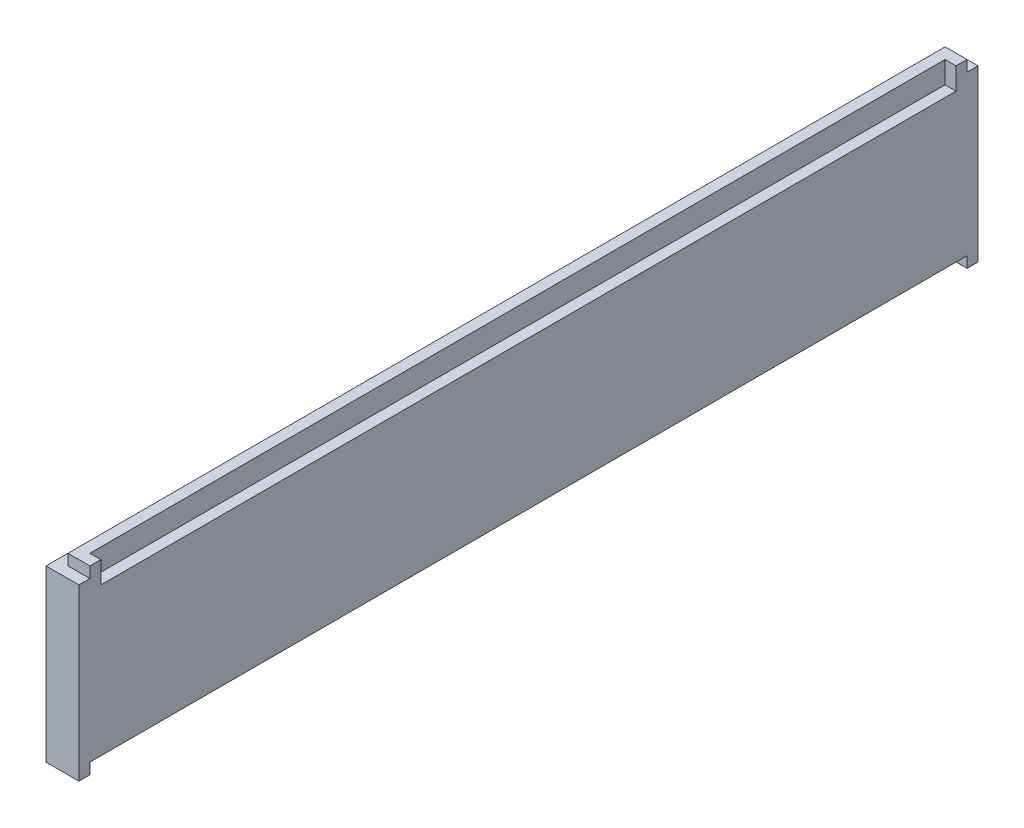
ISO-10303-21;
HEADER;
FILE_DESCRIPTION(('STEP AP214'),'2;1');
FILE_NAME('part.step','',(''),(''),'','','');
FILE_SCHEMA(('AUTOMOTIVE_DESIGN { 1 0 10303 214 1 1 1 1 }'));
ENDSEC;
DATA;
#1=APPLICATION_CONTEXT('core data for automotive mechanical design processes');
#2=APPLICATION_PROTOCOL_DEFINITION('international standard','automotive_design',2000,#1);
#3=PRODUCT_CONTEXT('',#1,'mechanical');
#4=PRODUCT('Part','Part','',(#3));
#5=PRODUCT_RELATED_PRODUCT_CATEGORY('part','',(#4));
#6=PRODUCT_DEFINITION_FORMATION('','',#4);
#7=PRODUCT_DEFINITION_CONTEXT('part definition',#1,'design');
#8=PRODUCT_DEFINITION('design','',#6,#7);
#9=PRODUCT_DEFINITION_SHAPE('','',#8);
#10=(LENGTH_UNIT() NAMED_UNIT(*) SI_UNIT(.MILLI.,.METRE.));
#11=(NAMED_UNIT(*) PLANE_ANGLE_UNIT() SI_UNIT($,.RADIAN.));
#12=(NAMED_UNIT(*) SI_UNIT($,.STERADIAN.) SOLID_ANGLE_UNIT());
#13=UNCERTAINTY_MEASURE_WITH_UNIT(LENGTH_MEASURE(1.E-05),#10,'distance_accuracy_value','');
#14=(GEOMETRIC_REPRESENTATION_CONTEXT(3) GLOBAL_UNCERTAINTY_ASSIGNED_CONTEXT((#13)) GLOBAL_UNIT_ASSIGNED_CONTEXT((#10,
#11,#12)) REPRESENTATION_CONTEXT('',''));
#15=CARTESIAN_POINT('',(0.,0.,0.));
#16=DIRECTION('',(0.,0.,1.));
#17=DIRECTION('',(1.,0.,0.));
#18=AXIS2_PLACEMENT_3D('',#15,#16,#17);
#19=CARTESIAN_POINT('',(20.,145.,820.));
#20=DIRECTION('',(0.,-1.,0.));
#21=DIRECTION('',(0.,0.,-1.));
#22=AXIS2_PLACEMENT_3D('',#19,#20,#21);
#23=PLANE('',#22);
#24=DIRECTION('',(-1.,0.,0.));
#25=VECTOR('',#24,1.);
#26=CARTESIAN_POINT('',(58.2842712474619,145.,20.));
#27=LINE('',#26,#25);
#28=CARTESIAN_POINT('',(30.,145.,20.0000000000002));
#29=VERTEX_POINT('',#28);
#30=CARTESIAN_POINT('',(20.,145.,20.0000000000002));
#31=VERTEX_POINT('',#30);
#32=EDGE_CURVE('E58',#29,#31,#27,.T.);
#33=ORIENTED_EDGE('',*,*,#32,.T.);
#34=DIRECTION('',(0.,0.,-1.));
#35=VECTOR('',#34,1.);
#36=CARTESIAN_POINT('',(20.,145.,820.));
#37=LINE('',#36,#35);
#38=CARTESIAN_POINT('',(20.,145.,800.));
#39=VERTEX_POINT('',#38);
#40=EDGE_CURVE('E254',#39,#31,#37,.T.);
#41=ORIENTED_EDGE('',*,*,#40,.F.);
#42=DIRECTION('',(-1.,0.,0.));
#43=VECTOR('',#42,1.);
#44=CARTESIAN_POINT('',(58.2842712474619,145.,800.));
#45=LINE('',#44,#43);
#46=CARTESIAN_POINT('',(30.,145.,800.));
#47=VERTEX_POINT('',#46);
#48=EDGE_CURVE('E196',#47,#39,#45,.T.);
#49=ORIENTED_EDGE('',*,*,#48,.F.);
#50=DIRECTION('',(0.,0.,-1.));
#51=VECTOR('',#50,1.);
#52=CARTESIAN_POINT('',(30.,145.,820.));
#53=LINE('',#52,#51);
#54=EDGE_CURVE('E256',#47,#29,#53,.T.);
#55=ORIENTED_EDGE('',*,*,#54,.T.);
#56=EDGE_LOOP('',(#33,#41,#49,#55));
#57=FACE_BOUND('',#56,.T.);
#58=ADVANCED_FACE('F35',(#57),#23,.F.);
#59=CARTESIAN_POINT('',(20.,165.,820.));
#60=DIRECTION('',(-1.,0.,0.));
#61=DIRECTION('',(0.,-1.,0.));
#62=AXIS2_PLACEMENT_3D('',#59,#60,#61);
#63=PLANE('',#62);
#64=DIRECTION('',(0.,-1.,0.));
#65=VECTOR('',#64,1.);
#66=CARTESIAN_POINT('',(20.,165.,20.));
#67=LINE('',#66,#65);
#68=CARTESIAN_POINT('',(20.,165.,20.0000000000002));
#69=VERTEX_POINT('',#68);
#70=EDGE_CURVE('E185',#69,#31,#67,.T.);
#71=ORIENTED_EDGE('',*,*,#70,.F.);
#72=DIRECTION('',(0.,0.,-1.));
#73=VECTOR('',#72,1.);
#74=CARTESIAN_POINT('',(20.,165.,820.));
#75=LINE('',#74,#73);
#76=CARTESIAN_POINT('',(20.,165.,800.));
#77=VERTEX_POINT('',#76);
#78=EDGE_CURVE('E252',#77,#69,#75,.T.);
#79=ORIENTED_EDGE('',*,*,#78,.F.);
#80=DIRECTION('',(0.,1.,0.));
#81=VECTOR('',#80,1.);
#82=CARTESIAN_POINT('',(20.,165.,800.));
#83=LINE('',#82,#81);
#84=EDGE_CURVE('E176',#39,#77,#83,.T.);
#85=ORIENTED_EDGE('',*,*,#84,.F.);
#86=ORIENTED_EDGE('',*,*,#40,.T.);
#87=EDGE_LOOP('',(#71,#79,#85,#86));
#88=FACE_BOUND('',#87,.T.);
#89=ADVANCED_FACE('F293',(#88),#63,.F.);
#90=CARTESIAN_POINT('',(10.,10.,820.));
#91=DIRECTION('',(-1.,0.,0.));
#92=DIRECTION('',(0.,-1.,0.));
#93=AXIS2_PLACEMENT_3D('',#90,#91,#92);
#94=PLANE('',#93);
#95=DIRECTION('',(0.,-1.,0.));
#96=VECTOR('',#95,1.);
#97=CARTESIAN_POINT('',(10.,0.,10.));
#98=LINE('',#97,#96);
#99=CARTESIAN_POINT('',(10.,10.,10.0000000000002));
#100=VERTEX_POINT('',#99);
#101=CARTESIAN_POINT('',(10.,0.,10.0000000000002));
#102=VERTEX_POINT('',#101);
#103=EDGE_CURVE('E192',#100,#102,#98,.T.);
#104=ORIENTED_EDGE('',*,*,#103,.F.);
#105=DIRECTION('',(0.,0.,-1.));
#106=VECTOR('',#105,1.);
#107=CARTESIAN_POINT('',(10.,10.,820.));
#108=LINE('',#107,#106);
#109=CARTESIAN_POINT('',(10.,10.,810.));
#110=VERTEX_POINT('',#109);
#111=EDGE_CURVE('E43',#110,#100,#108,.T.);
#112=ORIENTED_EDGE('',*,*,#111,.F.);
#113=DIRECTION('',(0.,1.,0.));
#114=VECTOR('',#113,1.);
#115=CARTESIAN_POINT('',(10.,0.,810.));
#116=LINE('',#115,#114);
#117=CARTESIAN_POINT('',(10.,0.,810.));
#118=VERTEX_POINT('',#117);
#119=EDGE_CURVE('E202',#118,#110,#116,.T.);
#120=ORIENTED_EDGE('',*,*,#119,.F.);
#121=DIRECTION('',(0.,0.,-1.));
#122=VECTOR('',#121,1.);
#123=CARTESIAN_POINT('',(10.,0.,820.));
#124=LINE('',#123,#122);
#125=EDGE_CURVE('E11',#118,#102,#124,.T.);
#126=ORIENTED_EDGE('',*,*,#125,.T.);
#127=EDGE_LOOP('',(#104,#112,#120,#126));
#128=FACE_BOUND('',#127,.T.);
#129=ADVANCED_FACE('F298',(#128),#94,.F.);
#130=CARTESIAN_POINT('',(30.,10.,820.));
#131=DIRECTION('',(0.,1.,0.));
#132=DIRECTION('',(-1.,0.,0.));
#133=AXIS2_PLACEMENT_3D('',#130,#131,#132);
#134=PLANE('',#133);
#135=DIRECTION('',(-1.,0.,0.));
#136=VECTOR('',#135,1.);
#137=CARTESIAN_POINT('',(44.142135623731,10.,10.));
#138=LINE('',#137,#136);
#139=CARTESIAN_POINT('',(30.,10.,10.0000000000002));
#140=VERTEX_POINT('',#139);
#141=EDGE_CURVE('E209',#140,#100,#138,.T.);
#142=ORIENTED_EDGE('',*,*,#141,.F.);
#143=DIRECTION('',(0.,0.,-1.));
#144=VECTOR('',#143,1.);
#145=CARTESIAN_POINT('',(30.,10.,820.));
#146=LINE('',#145,#144);
#147=CARTESIAN_POINT('',(30.,10.,810.));
#148=VERTEX_POINT('',#147);
#149=EDGE_CURVE('E258',#148,#140,#146,.T.);
#150=ORIENTED_EDGE('',*,*,#149,.F.);
#151=DIRECTION('',(-1.,0.,0.));
#152=VECTOR('',#151,1.);
#153=CARTESIAN_POINT('',(44.142135623731,10.,810.));
#154=LINE('',#153,#152);
#155=EDGE_CURVE('E223',#148,#110,#154,.T.);
#156=ORIENTED_EDGE('',*,*,#155,.T.);
#157=ORIENTED_EDGE('',*,*,#111,.T.);
#158=EDGE_LOOP('',(#142,#150,#156,#157));
#159=FACE_BOUND('',#158,.T.);
#160=ADVANCED_FACE('F263',(#159),#134,.F.);
#161=CARTESIAN_POINT('',(10.,0.,820.));
#162=DIRECTION('',(0.,1.,0.));
#163=DIRECTION('',(0.,0.,1.));
#164=AXIS2_PLACEMENT_3D('',#161,#162,#163);
#165=PLANE('',#164);
#166=DIRECTION('',(1.,0.,0.));
#167=VECTOR('',#166,1.);
#168=CARTESIAN_POINT('',(10.,0.,0.));
#169=LINE('',#168,#167);
#170=CARTESIAN_POINT('',(0.,0.,0.));
#171=VERTEX_POINT('',#170);
#172=CARTESIAN_POINT('',(30.,0.,0.));
#173=VERTEX_POINT('',#172);
#174=EDGE_CURVE('E221',#171,#173,#169,.T.);
#175=ORIENTED_EDGE('',*,*,#174,.T.);
#176=DIRECTION('',(0.,0.,1.));
#177=VECTOR('',#176,1.);
#178=CARTESIAN_POINT('',(30.,0.,0.));
#179=LINE('',#178,#177);
#180=CARTESIAN_POINT('',(30.,0.,10.));
#181=VERTEX_POINT('',#180);
#182=EDGE_CURVE('E199',#173,#181,#179,.T.);
#183=ORIENTED_EDGE('',*,*,#182,.T.);
#184=DIRECTION('',(-1.,0.,0.));
#185=VECTOR('',#184,1.);
#186=CARTESIAN_POINT('',(44.142135623731,0.,10.));
#187=LINE('',#186,#185);
#188=EDGE_CURVE('E206',#181,#102,#187,.T.);
#189=ORIENTED_EDGE('',*,*,#188,.T.);
#190=ORIENTED_EDGE('',*,*,#125,.F.);
#191=DIRECTION('',(-1.,0.,0.));
#192=VECTOR('',#191,1.);
#193=CARTESIAN_POINT('',(44.142135623731,0.,810.));
#194=LINE('',#193,#192);
#195=CARTESIAN_POINT('',(30.,0.,810.));
#196=VERTEX_POINT('',#195);
#197=EDGE_CURVE('E218',#196,#118,#194,.T.);
#198=ORIENTED_EDGE('',*,*,#197,.F.);
#199=DIRECTION('',(0.,0.,1.));
#200=VECTOR('',#199,1.);
#201=CARTESIAN_POINT('',(30.,0.,820.));
#202=LINE('',#201,#200);
#203=CARTESIAN_POINT('',(30.,0.,820.));
#204=VERTEX_POINT('',#203);
#205=EDGE_CURVE('E217',#196,#204,#202,.T.);
#206=ORIENTED_EDGE('',*,*,#205,.T.);
#207=DIRECTION('',(1.,0.,0.));
#208=VECTOR('',#207,1.);
#209=CARTESIAN_POINT('',(10.,0.,820.));
#210=LINE('',#209,#208);
#211=CARTESIAN_POINT('',(0.,0.,820.));
#212=VERTEX_POINT('',#211);
#213=EDGE_CURVE('E227',#212,#204,#210,.T.);
#214=ORIENTED_EDGE('',*,*,#213,.F.);
#215=DIRECTION('',(0.,0.,-1.));
#216=VECTOR('',#215,1.);
#217=CARTESIAN_POINT('',(0.,0.,820.));
#218=LINE('',#217,#216);
#219=EDGE_CURVE('E237',#212,#171,#218,.T.);
#220=ORIENTED_EDGE('',*,*,#219,.T.);
#221=EDGE_LOOP('',(#175,#183,#189,#190,#198,#206,#214,#220));
#222=FACE_BOUND('',#221,.T.);
#223=ADVANCED_FACE('F37',(#222),#165,.F.);
#224=CARTESIAN_POINT('',(30.,145.,820.));
#225=DIRECTION('',(-1.,0.,0.));
#226=DIRECTION('',(0.,-1.,0.));
#227=AXIS2_PLACEMENT_3D('',#224,#225,#226);
#228=PLANE('',#227);
#229=DIRECTION('',(0.,1.,0.));
#230=VECTOR('',#229,1.);
#231=CARTESIAN_POINT('',(30.,145.,0.));
#232=LINE('',#231,#230);
#233=CARTESIAN_POINT('',(30.,155.,0.));
#234=VERTEX_POINT('',#233);
#235=EDGE_CURVE('E239',#173,#234,#232,.T.);
#236=ORIENTED_EDGE('',*,*,#235,.T.);
#237=DIRECTION('',(0.,0.,-1.));
#238=VECTOR('',#237,1.);
#239=CARTESIAN_POINT('',(30.,155.,0.));
#240=LINE('',#239,#238);
#241=CARTESIAN_POINT('',(30.,155.,10.));
#242=VERTEX_POINT('',#241);
#243=EDGE_CURVE('E162',#242,#234,#240,.T.);
#244=ORIENTED_EDGE('',*,*,#243,.F.);
#245=DIRECTION('',(0.,-1.,0.));
#246=VECTOR('',#245,1.);
#247=CARTESIAN_POINT('',(30.,165.,10.));
#248=LINE('',#247,#246);
#249=CARTESIAN_POINT('',(30.,165.,10.));
#250=VERTEX_POINT('',#249);
#251=EDGE_CURVE('E153',#250,#242,#248,.T.);
#252=ORIENTED_EDGE('',*,*,#251,.F.);
#253=DIRECTION('',(0.,0.,-1.));
#254=VECTOR('',#253,1.);
#255=CARTESIAN_POINT('',(30.,165.,0.));
#256=LINE('',#255,#254);
#257=CARTESIAN_POINT('',(30.,165.,20.));
#258=VERTEX_POINT('',#257);
#259=EDGE_CURVE('E168',#258,#250,#256,.T.);
#260=ORIENTED_EDGE('',*,*,#259,.F.);
#261=DIRECTION('',(0.,1.,0.));
#262=VECTOR('',#261,1.);
#263=CARTESIAN_POINT('',(30.,165.,20.));
#264=LINE('',#263,#262);
#265=EDGE_CURVE('E177',#29,#258,#264,.T.);
#266=ORIENTED_EDGE('',*,*,#265,.F.);
#267=ORIENTED_EDGE('',*,*,#54,.F.);
#268=DIRECTION('',(0.,-1.,0.));
#269=VECTOR('',#268,1.);
#270=CARTESIAN_POINT('',(30.,165.,800.));
#271=LINE('',#270,#269);
#272=CARTESIAN_POINT('',(30.,165.,800.));
#273=VERTEX_POINT('',#272);
#274=EDGE_CURVE('E191',#273,#47,#271,.T.);
#275=ORIENTED_EDGE('',*,*,#274,.F.);
#276=DIRECTION('',(0.,0.,-1.));
#277=VECTOR('',#276,1.);
#278=CARTESIAN_POINT('',(30.,165.,820.));
#279=LINE('',#278,#277);
#280=CARTESIAN_POINT('',(30.,165.,810.));
#281=VERTEX_POINT('',#280);
#282=EDGE_CURVE('E193',#281,#273,#279,.T.);
#283=ORIENTED_EDGE('',*,*,#282,.F.);
#284=DIRECTION('',(0.,1.,0.));
#285=VECTOR('',#284,1.);
#286=CARTESIAN_POINT('',(30.,165.,810.));
#287=LINE('',#286,#285);
#288=CARTESIAN_POINT('',(30.,155.,810.));
#289=VERTEX_POINT('',#288);
#290=EDGE_CURVE('E325',#289,#281,#287,.T.);
#291=ORIENTED_EDGE('',*,*,#290,.F.);
#292=DIRECTION('',(0.,0.,-1.));
#293=VECTOR('',#292,1.);
#294=CARTESIAN_POINT('',(30.,155.,820.));
#295=LINE('',#294,#293);
#296=CARTESIAN_POINT('',(30.,155.,820.));
#297=VERTEX_POINT('',#296);
#298=EDGE_CURVE('E314',#297,#289,#295,.T.);
#299=ORIENTED_EDGE('',*,*,#298,.F.);
#300=DIRECTION('',(0.,1.,0.));
#301=VECTOR('',#300,1.);
#302=CARTESIAN_POINT('',(30.,145.,820.));
#303=LINE('',#302,#301);
#304=EDGE_CURVE('E229',#204,#297,#303,.T.);
#305=ORIENTED_EDGE('',*,*,#304,.F.);
#306=ORIENTED_EDGE('',*,*,#205,.F.);
#307=DIRECTION('',(0.,-1.,0.));
#308=VECTOR('',#307,1.);
#309=CARTESIAN_POINT('',(30.,0.,810.));
#310=LINE('',#309,#308);
#311=EDGE_CURVE('E214',#148,#196,#310,.T.);
#312=ORIENTED_EDGE('',*,*,#311,.F.);
#313=ORIENTED_EDGE('',*,*,#149,.T.);
#314=DIRECTION('',(0.,1.,0.));
#315=VECTOR('',#314,1.);
#316=CARTESIAN_POINT('',(30.,0.,10.));
#317=LINE('',#316,#315);
#318=EDGE_CURVE('E203',#181,#140,#317,.T.);
#319=ORIENTED_EDGE('',*,*,#318,.F.);
#320=ORIENTED_EDGE('',*,*,#182,.F.);
#321=EDGE_LOOP('',(#236,#244,#252,#260,#266,#267,#275,#283,#291,#299,#305,#306,#312,#313,#319,#320));
#322=FACE_BOUND('',#321,.T.);
#323=ADVANCED_FACE('F166',(#322),#228,.F.);
#324=CARTESIAN_POINT('',(9.99999999999996,165.,820.));
#325=DIRECTION('',(0.,-1.,0.));
#326=DIRECTION('',(0.,0.,-1.));
#327=AXIS2_PLACEMENT_3D('',#324,#325,#326);
#328=PLANE('',#327);
#329=ORIENTED_EDGE('',*,*,#259,.T.);
#330=DIRECTION('',(1.,0.,0.));
#331=VECTOR('',#330,1.);
#332=CARTESIAN_POINT('',(0.,165.,10.));
#333=LINE('',#332,#331);
#334=CARTESIAN_POINT('',(9.99999999999996,165.,10.));
#335=VERTEX_POINT('',#334);
#336=EDGE_CURVE('E150',#335,#250,#333,.T.);
#337=ORIENTED_EDGE('',*,*,#336,.F.);
#338=DIRECTION('',(0.,0.,-1.));
#339=VECTOR('',#338,1.);
#340=CARTESIAN_POINT('',(9.99999999999996,165.,820.));
#341=LINE('',#340,#339);
#342=CARTESIAN_POINT('',(9.99999999999996,165.,810.));
#343=VERTEX_POINT('',#342);
#344=EDGE_CURVE('E250',#343,#335,#341,.T.);
#345=ORIENTED_EDGE('',*,*,#344,.F.);
#346=DIRECTION('',(1.,0.,0.));
#347=VECTOR('',#346,1.);
#348=CARTESIAN_POINT('',(0.,165.,810.));
#349=LINE('',#348,#347);
#350=EDGE_CURVE('E328',#343,#281,#349,.T.);
#351=ORIENTED_EDGE('',*,*,#350,.T.);
#352=ORIENTED_EDGE('',*,*,#282,.T.);
#353=DIRECTION('',(-1.,0.,0.));
#354=VECTOR('',#353,1.);
#355=CARTESIAN_POINT('',(58.2842712474619,165.,800.));
#356=LINE('',#355,#354);
#357=EDGE_CURVE('E180',#273,#77,#356,.T.);
#358=ORIENTED_EDGE('',*,*,#357,.T.);
#359=ORIENTED_EDGE('',*,*,#78,.T.);
#360=DIRECTION('',(-1.,0.,0.));
#361=VECTOR('',#360,1.);
#362=CARTESIAN_POINT('',(58.2842712474619,165.,20.));
#363=LINE('',#362,#361);
#364=EDGE_CURVE('E174',#258,#69,#363,.T.);
#365=ORIENTED_EDGE('',*,*,#364,.F.);
#366=EDGE_LOOP('',(#329,#337,#345,#351,#352,#358,#359,#365));
#367=FACE_BOUND('',#366,.T.);
#368=ADVANCED_FACE('F171',(#367),#328,.F.);
#369=CARTESIAN_POINT('',(9.99999999999996,155.,820.));
#370=DIRECTION('',(1.,0.,0.));
#371=DIRECTION('',(0.,0.,-1.));
#372=AXIS2_PLACEMENT_3D('',#369,#370,#371);
#373=PLANE('',#372);
#374=ORIENTED_EDGE('',*,*,#344,.T.);
#375=DIRECTION('',(0.,-1.,0.));
#376=VECTOR('',#375,1.);
#377=CARTESIAN_POINT('',(9.99999999999996,155.,10.));
#378=LINE('',#377,#376);
#379=CARTESIAN_POINT('',(9.99999999999996,155.,10.));
#380=VERTEX_POINT('',#379);
#381=EDGE_CURVE('E156',#335,#380,#378,.T.);
#382=ORIENTED_EDGE('',*,*,#381,.T.);
#383=DIRECTION('',(0.,0.,-1.));
#384=VECTOR('',#383,1.);
#385=CARTESIAN_POINT('',(9.99999999999996,155.,820.));
#386=LINE('',#385,#384);
#387=CARTESIAN_POINT('',(9.99999999999996,155.,810.));
#388=VERTEX_POINT('',#387);
#389=EDGE_CURVE('E247',#388,#380,#386,.T.);
#390=ORIENTED_EDGE('',*,*,#389,.F.);
#391=DIRECTION('',(0.,1.,0.));
#392=VECTOR('',#391,1.);
#393=CARTESIAN_POINT('',(9.99999999999996,155.,810.));
#394=LINE('',#393,#392);
#395=EDGE_CURVE('E188',#388,#343,#394,.T.);
#396=ORIENTED_EDGE('',*,*,#395,.T.);
#397=EDGE_LOOP('',(#374,#382,#390,#396));
#398=FACE_BOUND('',#397,.T.);
#399=ADVANCED_FACE('F334',(#398),#373,.F.);
#400=CARTESIAN_POINT('',(0.,155.,820.));
#401=DIRECTION('',(0.,-1.,0.));
#402=DIRECTION('',(0.,0.,-1.));
#403=AXIS2_PLACEMENT_3D('',#400,#401,#402);
#404=PLANE('',#403);
#405=ORIENTED_EDGE('',*,*,#389,.T.);
#406=DIRECTION('',(1.,0.,0.));
#407=VECTOR('',#406,1.);
#408=CARTESIAN_POINT('',(0.,155.,10.));
#409=LINE('',#408,#407);
#410=EDGE_CURVE('E161',#380,#242,#409,.T.);
#411=ORIENTED_EDGE('',*,*,#410,.T.);
#412=ORIENTED_EDGE('',*,*,#243,.T.);
#413=DIRECTION('',(-1.,0.,0.));
#414=VECTOR('',#413,1.);
#415=CARTESIAN_POINT('',(0.,155.,0.));
#416=LINE('',#415,#414);
#417=CARTESIAN_POINT('',(0.,155.,0.));
#418=VERTEX_POINT('',#417);
#419=EDGE_CURVE('E50',#234,#418,#416,.T.);
#420=ORIENTED_EDGE('',*,*,#419,.T.);
#421=DIRECTION('',(0.,0.,-1.));
#422=VECTOR('',#421,1.);
#423=CARTESIAN_POINT('',(0.,155.,820.));
#424=LINE('',#423,#422);
#425=CARTESIAN_POINT('',(0.,155.,820.));
#426=VERTEX_POINT('',#425);
#427=EDGE_CURVE('E245',#426,#418,#424,.T.);
#428=ORIENTED_EDGE('',*,*,#427,.F.);
#429=DIRECTION('',(-1.,0.,0.));
#430=VECTOR('',#429,1.);
#431=CARTESIAN_POINT('',(0.,155.,820.));
#432=LINE('',#431,#430);
#433=EDGE_CURVE('E233',#297,#426,#432,.T.);
#434=ORIENTED_EDGE('',*,*,#433,.F.);
#435=ORIENTED_EDGE('',*,*,#298,.T.);
#436=DIRECTION('',(1.,0.,0.));
#437=VECTOR('',#436,1.);
#438=CARTESIAN_POINT('',(0.,155.,810.));
#439=LINE('',#438,#437);
#440=EDGE_CURVE('E327',#388,#289,#439,.T.);
#441=ORIENTED_EDGE('',*,*,#440,.F.);
#442=EDGE_LOOP('',(#405,#411,#412,#420,#428,#434,#435,#441));
#443=FACE_BOUND('',#442,.T.);
#444=ADVANCED_FACE('F319',(#443),#404,.F.);
#445=CARTESIAN_POINT('',(0.,0.,820.));
#446=DIRECTION('',(1.,0.,0.));
#447=DIRECTION('',(0.,1.,0.));
#448=AXIS2_PLACEMENT_3D('',#445,#446,#447);
#449=PLANE('',#448);
#450=DIRECTION('',(0.,-1.,0.));
#451=VECTOR('',#450,1.);
#452=CARTESIAN_POINT('',(0.,0.,0.));
#453=LINE('',#452,#451);
#454=EDGE_CURVE('E230',#418,#171,#453,.T.);
#455=ORIENTED_EDGE('',*,*,#454,.T.);
#456=ORIENTED_EDGE('',*,*,#219,.F.);
#457=DIRECTION('',(0.,-1.,0.));
#458=VECTOR('',#457,1.);
#459=CARTESIAN_POINT('',(0.,0.,820.));
#460=LINE('',#459,#458);
#461=EDGE_CURVE('E235',#426,#212,#460,.T.);
#462=ORIENTED_EDGE('',*,*,#461,.F.);
#463=ORIENTED_EDGE('',*,*,#427,.T.);
#464=EDGE_LOOP('',(#455,#456,#462,#463));
#465=FACE_BOUND('',#464,.T.);
#466=ADVANCED_FACE('F288',(#465),#449,.F.);
#467=CARTESIAN_POINT('',(0.,0.,820.));
#468=DIRECTION('',(0.,0.,-1.));
#469=DIRECTION('',(-1.,0.,0.));
#470=AXIS2_PLACEMENT_3D('',#467,#468,#469);
#471=PLANE('',#470);
#472=ORIENTED_EDGE('',*,*,#304,.T.);
#473=ORIENTED_EDGE('',*,*,#433,.T.);
#474=ORIENTED_EDGE('',*,*,#461,.T.);
#475=ORIENTED_EDGE('',*,*,#213,.T.);
#476=EDGE_LOOP('',(#472,#473,#474,#475));
#477=FACE_BOUND('',#476,.T.);
#478=ADVANCED_FACE('F280',(#477),#471,.F.);
#479=CARTESIAN_POINT('',(0.,0.,0.));
#480=DIRECTION('',(0.,0.,-1.));
#481=DIRECTION('',(-1.,0.,0.));
#482=AXIS2_PLACEMENT_3D('',#479,#480,#481);
#483=PLANE('',#482);
#484=ORIENTED_EDGE('',*,*,#419,.F.);
#485=ORIENTED_EDGE('',*,*,#235,.F.);
#486=ORIENTED_EDGE('',*,*,#174,.F.);
#487=ORIENTED_EDGE('',*,*,#454,.F.);
#488=EDGE_LOOP('',(#484,#485,#486,#487));
#489=FACE_BOUND('',#488,.T.);
#490=ADVANCED_FACE('F277',(#489),#483,.T.);
#491=CARTESIAN_POINT('',(44.142135623731,0.,810.));
#492=DIRECTION('',(0.,0.,1.));
#493=DIRECTION('',(0.,-1.,0.));
#494=AXIS2_PLACEMENT_3D('',#491,#492,#493);
#495=PLANE('',#494);
#496=ORIENTED_EDGE('',*,*,#155,.F.);
#497=ORIENTED_EDGE('',*,*,#311,.T.);
#498=ORIENTED_EDGE('',*,*,#197,.T.);
#499=ORIENTED_EDGE('',*,*,#119,.T.);
#500=EDGE_LOOP('',(#496,#497,#498,#499));
#501=FACE_BOUND('',#500,.T.);
#502=ADVANCED_FACE('F279',(#501),#495,.F.);
#503=CARTESIAN_POINT('',(44.142135623731,0.,10.));
#504=DIRECTION('',(0.,0.,-1.));
#505=DIRECTION('',(-1.,0.,0.));
#506=AXIS2_PLACEMENT_3D('',#503,#504,#505);
#507=PLANE('',#506);
#508=ORIENTED_EDGE('',*,*,#188,.F.);
#509=ORIENTED_EDGE('',*,*,#318,.T.);
#510=ORIENTED_EDGE('',*,*,#141,.T.);
#511=ORIENTED_EDGE('',*,*,#103,.T.);
#512=EDGE_LOOP('',(#508,#509,#510,#511));
#513=FACE_BOUND('',#512,.T.);
#514=ADVANCED_FACE('F270',(#513),#507,.F.);
#515=CARTESIAN_POINT('',(58.2842712474619,165.,800.));
#516=DIRECTION('',(0.,0.,1.));
#517=DIRECTION('',(1.,0.,0.));
#518=AXIS2_PLACEMENT_3D('',#515,#516,#517);
#519=PLANE('',#518);
#520=ORIENTED_EDGE('',*,*,#357,.F.);
#521=ORIENTED_EDGE('',*,*,#274,.T.);
#522=ORIENTED_EDGE('',*,*,#48,.T.);
#523=ORIENTED_EDGE('',*,*,#84,.T.);
#524=EDGE_LOOP('',(#520,#521,#522,#523));
#525=FACE_BOUND('',#524,.T.);
#526=ADVANCED_FACE('F343',(#525),#519,.F.);
#527=CARTESIAN_POINT('',(58.2842712474619,165.,20.));
#528=DIRECTION('',(0.,0.,-1.));
#529=DIRECTION('',(-1.,0.,0.));
#530=AXIS2_PLACEMENT_3D('',#527,#528,#529);
#531=PLANE('',#530);
#532=ORIENTED_EDGE('',*,*,#32,.F.);
#533=ORIENTED_EDGE('',*,*,#265,.T.);
#534=ORIENTED_EDGE('',*,*,#364,.T.);
#535=ORIENTED_EDGE('',*,*,#70,.T.);
#536=EDGE_LOOP('',(#532,#533,#534,#535));
#537=FACE_BOUND('',#536,.T.);
#538=ADVANCED_FACE('F347',(#537),#531,.F.);
#539=CARTESIAN_POINT('',(0.,165.,810.));
#540=DIRECTION('',(0.,0.,-1.));
#541=DIRECTION('',(-1.,0.,0.));
#542=AXIS2_PLACEMENT_3D('',#539,#540,#541);
#543=PLANE('',#542);
#544=ORIENTED_EDGE('',*,*,#440,.T.);
#545=ORIENTED_EDGE('',*,*,#290,.T.);
#546=ORIENTED_EDGE('',*,*,#350,.F.);
#547=ORIENTED_EDGE('',*,*,#395,.F.);
#548=EDGE_LOOP('',(#544,#545,#546,#547));
#549=FACE_BOUND('',#548,.T.);
#550=ADVANCED_FACE('F349',(#549),#543,.F.);
#551=CARTESIAN_POINT('',(0.,165.,10.));
#552=DIRECTION('',(0.,0.,1.));
#553=DIRECTION('',(1.,0.,0.));
#554=AXIS2_PLACEMENT_3D('',#551,#552,#553);
#555=PLANE('',#554);
#556=ORIENTED_EDGE('',*,*,#336,.T.);
#557=ORIENTED_EDGE('',*,*,#251,.T.);
#558=ORIENTED_EDGE('',*,*,#410,.F.);
#559=ORIENTED_EDGE('',*,*,#381,.F.);
#560=EDGE_LOOP('',(#556,#557,#558,#559));
#561=FACE_BOUND('',#560,.T.);
#562=ADVANCED_FACE('F152',(#561),#555,.F.);
#563=CLOSED_SHELL('',(#58,#89,#129,#160,#223,#323,#368,#399,#444,#466,#478,#490,#502,#514,#526,
#538,#550,#562));
#564=MANIFOLD_SOLID_BREP('B2',#563);
#565=ADVANCED_BREP_SHAPE_REPRESENTATION('',(#18,#564),#14);
#566=SHAPE_DEFINITION_REPRESENTATION(#9,#565);
ENDSEC;
END-ISO-10303-21;
